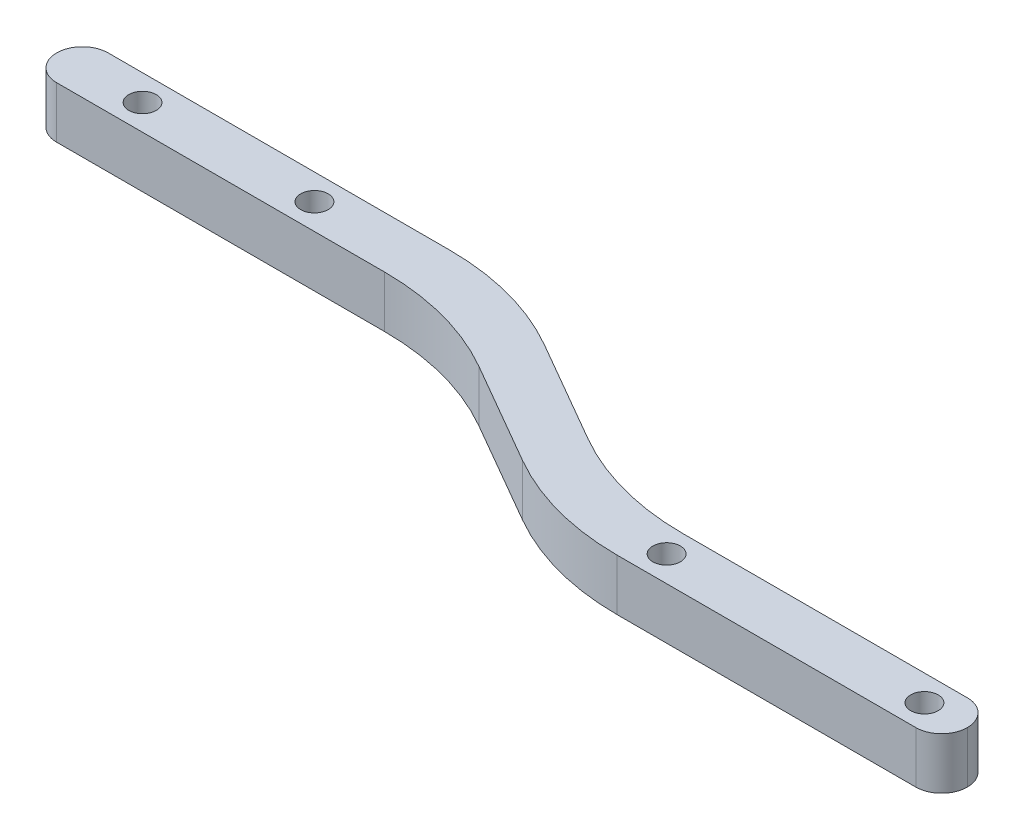
ISO-10303-21;
HEADER;
FILE_DESCRIPTION(('STEP AP214'),'2;1');
FILE_NAME('part.step','',(''),(''),'','','');
FILE_SCHEMA(('AUTOMOTIVE_DESIGN { 1 0 10303 214 1 1 1 1 }'));
ENDSEC;
DATA;
#1=APPLICATION_CONTEXT('core data for automotive mechanical design processes');
#2=APPLICATION_PROTOCOL_DEFINITION('international standard','automotive_design',2000,#1);
#3=PRODUCT_CONTEXT('',#1,'mechanical');
#4=PRODUCT('Part','Part','',(#3));
#5=PRODUCT_RELATED_PRODUCT_CATEGORY('part','',(#4));
#6=PRODUCT_DEFINITION_FORMATION('','',#4);
#7=PRODUCT_DEFINITION_CONTEXT('part definition',#1,'design');
#8=PRODUCT_DEFINITION('design','',#6,#7);
#9=PRODUCT_DEFINITION_SHAPE('','',#8);
#10=(LENGTH_UNIT() NAMED_UNIT(*) SI_UNIT(.MILLI.,.METRE.));
#11=(NAMED_UNIT(*) PLANE_ANGLE_UNIT() SI_UNIT($,.RADIAN.));
#12=(NAMED_UNIT(*) SI_UNIT($,.STERADIAN.) SOLID_ANGLE_UNIT());
#13=UNCERTAINTY_MEASURE_WITH_UNIT(LENGTH_MEASURE(1.E-05),#10,'distance_accuracy_value','');
#14=(GEOMETRIC_REPRESENTATION_CONTEXT(3) GLOBAL_UNCERTAINTY_ASSIGNED_CONTEXT((#13)) GLOBAL_UNIT_ASSIGNED_CONTEXT((#10,
#11,#12)) REPRESENTATION_CONTEXT('',''));
#15=CARTESIAN_POINT('',(0.,0.,0.));
#16=DIRECTION('',(0.,0.,1.));
#17=DIRECTION('',(1.,0.,0.));
#18=AXIS2_PLACEMENT_3D('',#15,#16,#17);
#19=CARTESIAN_POINT('',(-22.0980762113533,3.,0.));
#20=DIRECTION('',(-0.5,0.,0.866025403784439));
#21=DIRECTION('',(0.866025403784439,0.,0.5));
#22=AXIS2_PLACEMENT_3D('',#19,#20,#21);
#23=PLANE('',#22);
#24=DIRECTION('',(-0.866025403784439,0.,-0.5));
#25=VECTOR('',#24,1.);
#26=CARTESIAN_POINT('',(-22.0980762113533,-3.,0.));
#27=LINE('',#26,#25);
#28=CARTESIAN_POINT('',(-29.0596004384196,-3.,-4.01923788646684));
#29=VERTEX_POINT('',#28);
#30=CARTESIAN_POINT('',(-41.1173140978201,-3.,-10.9807621135331));
#31=VERTEX_POINT('',#30);
#32=EDGE_CURVE('E294',#29,#31,#27,.T.);
#33=ORIENTED_EDGE('',*,*,#32,.T.);
#34=DIRECTION('',(0.,-1.,0.));
#35=VECTOR('',#34,1.);
#36=CARTESIAN_POINT('',(-41.1173140978201,3.,-10.9807621135331));
#37=LINE('',#36,#35);
#38=CARTESIAN_POINT('',(-41.1173140978201,3.,-10.9807621135331));
#39=VERTEX_POINT('',#38);
#40=EDGE_CURVE('E211',#31,#39,#37,.F.);
#41=ORIENTED_EDGE('',*,*,#40,.T.);
#42=DIRECTION('',(-0.866025403784439,0.,-0.5));
#43=VECTOR('',#42,1.);
#44=CARTESIAN_POINT('',(-22.0980762113533,3.,0.));
#45=LINE('',#44,#43);
#46=CARTESIAN_POINT('',(-29.0596004384196,3.,-4.01923788646684));
#47=VERTEX_POINT('',#46);
#48=EDGE_CURVE('E180',#47,#39,#45,.T.);
#49=ORIENTED_EDGE('',*,*,#48,.F.);
#50=DIRECTION('',(0.,-1.,0.));
#51=VECTOR('',#50,1.);
#52=CARTESIAN_POINT('',(-29.0596004384196,-3.,-4.01923788646685));
#53=LINE('',#52,#51);
#54=EDGE_CURVE('E207',#47,#29,#53,.T.);
#55=ORIENTED_EDGE('',*,*,#54,.T.);
#56=EDGE_LOOP('',(#33,#41,#49,#55));
#57=FACE_BOUND('',#56,.T.);
#58=ADVANCED_FACE('F39',(#57),#23,.F.);
#59=CARTESIAN_POINT('',(-48.0788383248864,3.,-15.));
#60=DIRECTION('',(0.,0.,1.));
#61=DIRECTION('',(1.,0.,0.));
#62=AXIS2_PLACEMENT_3D('',#59,#60,#61);
#63=PLANE('',#62);
#64=DIRECTION('',(-1.,0.,0.));
#65=VECTOR('',#64,1.);
#66=CARTESIAN_POINT('',(-48.0788383248864,-3.,-15.));
#67=LINE('',#66,#65);
#68=CARTESIAN_POINT('',(-56.1173140978201,-3.,-15.));
#69=VERTEX_POINT('',#68);
#70=CARTESIAN_POINT('',(-95.8826859021798,-3.,-15.));
#71=VERTEX_POINT('',#70);
#72=EDGE_CURVE('E298',#69,#71,#67,.T.);
#73=ORIENTED_EDGE('',*,*,#72,.T.);
#74=DIRECTION('',(0.,-1.,0.));
#75=VECTOR('',#74,1.);
#76=CARTESIAN_POINT('',(-95.8826859021798,3.,-15.));
#77=LINE('',#76,#75);
#78=CARTESIAN_POINT('',(-95.8826859021798,3.,-15.));
#79=VERTEX_POINT('',#78);
#80=EDGE_CURVE('E65',#71,#79,#77,.F.);
#81=ORIENTED_EDGE('',*,*,#80,.T.);
#82=DIRECTION('',(-1.,0.,0.));
#83=VECTOR('',#82,1.);
#84=CARTESIAN_POINT('',(-48.0788383248864,3.,-15.));
#85=LINE('',#84,#83);
#86=CARTESIAN_POINT('',(-56.1173140978201,3.,-15.));
#87=VERTEX_POINT('',#86);
#88=EDGE_CURVE('E318',#87,#79,#85,.T.);
#89=ORIENTED_EDGE('',*,*,#88,.F.);
#90=DIRECTION('',(0.,-1.,0.));
#91=VECTOR('',#90,1.);
#92=CARTESIAN_POINT('',(-56.1173140978201,3.,-15.));
#93=LINE('',#92,#91);
#94=EDGE_CURVE('E203',#87,#69,#93,.T.);
#95=ORIENTED_EDGE('',*,*,#94,.T.);
#96=EDGE_LOOP('',(#73,#81,#89,#95));
#97=FACE_BOUND('',#96,.T.);
#98=ADVANCED_FACE('F385',(#97),#63,.F.);
#99=CARTESIAN_POINT('',(-98.8826859021798,3.,-8.99999999999997));
#100=DIRECTION('',(0.,0.,-1.));
#101=DIRECTION('',(-1.,0.,0.));
#102=AXIS2_PLACEMENT_3D('',#99,#100,#101);
#103=PLANE('',#102);
#104=DIRECTION('',(1.,0.,0.));
#105=VECTOR('',#104,1.);
#106=CARTESIAN_POINT('',(-98.8826859021798,3.,-8.99999999999997));
#107=LINE('',#106,#105);
#108=CARTESIAN_POINT('',(-95.8826859021798,3.,-8.99999999999997));
#109=VERTEX_POINT('',#108);
#110=CARTESIAN_POINT('',(-57.7250092524069,3.,-8.99999999999997));
#111=VERTEX_POINT('',#110);
#112=EDGE_CURVE('E313',#109,#111,#107,.T.);
#113=ORIENTED_EDGE('',*,*,#112,.F.);
#114=DIRECTION('',(0.,-1.,0.));
#115=VECTOR('',#114,1.);
#116=CARTESIAN_POINT('',(-95.8826859021798,3.,-8.99999999999997));
#117=LINE('',#116,#115);
#118=CARTESIAN_POINT('',(-95.8826859021798,-3.,-8.99999999999997));
#119=VERTEX_POINT('',#118);
#120=EDGE_CURVE('E232',#109,#119,#117,.T.);
#121=ORIENTED_EDGE('',*,*,#120,.T.);
#122=DIRECTION('',(1.,0.,0.));
#123=VECTOR('',#122,1.);
#124=CARTESIAN_POINT('',(-98.8826859021798,-3.,-8.99999999999997));
#125=LINE('',#124,#123);
#126=CARTESIAN_POINT('',(-57.7250092524069,-3.,-8.99999999999997));
#127=VERTEX_POINT('',#126);
#128=EDGE_CURVE('E182',#119,#127,#125,.T.);
#129=ORIENTED_EDGE('',*,*,#128,.T.);
#130=DIRECTION('',(0.,-1.,0.));
#131=VECTOR('',#130,1.);
#132=CARTESIAN_POINT('',(-57.7250092524069,3.,-8.99999999999997));
#133=LINE('',#132,#131);
#134=EDGE_CURVE('E199',#127,#111,#133,.F.);
#135=ORIENTED_EDGE('',*,*,#134,.T.);
#136=EDGE_LOOP('',(#113,#121,#129,#135));
#137=FACE_BOUND('',#136,.T.);
#138=ADVANCED_FACE('F304',(#137),#103,.F.);
#139=CARTESIAN_POINT('',(-49.6865334794732,3.,-8.99999999999997));
#140=DIRECTION('',(0.499999999999999,0.,-0.866025403784439));
#141=DIRECTION('',(-0.866025403784439,0.,-0.5));
#142=AXIS2_PLACEMENT_3D('',#139,#140,#141);
#143=PLANE('',#142);
#144=DIRECTION('',(0.866025403784439,0.,0.5));
#145=VECTOR('',#144,1.);
#146=CARTESIAN_POINT('',(-49.6865334794732,-3.,-8.99999999999997));
#147=LINE('',#146,#145);
#148=CARTESIAN_POINT('',(-42.7250092524069,-3.,-4.98076211353314));
#149=VERTEX_POINT('',#148);
#150=CARTESIAN_POINT('',(-30.6672955930064,-3.,1.98076211353317));
#151=VERTEX_POINT('',#150);
#152=EDGE_CURVE('E176',#149,#151,#147,.T.);
#153=ORIENTED_EDGE('',*,*,#152,.T.);
#154=DIRECTION('',(0.,-1.,0.));
#155=VECTOR('',#154,1.);
#156=CARTESIAN_POINT('',(-30.6672955930064,3.,1.98076211353317));
#157=LINE('',#156,#155);
#158=CARTESIAN_POINT('',(-30.6672955930064,3.,1.98076211353317));
#159=VERTEX_POINT('',#158);
#160=EDGE_CURVE('E149',#151,#159,#157,.F.);
#161=ORIENTED_EDGE('',*,*,#160,.T.);
#162=DIRECTION('',(0.866025403784439,0.,0.5));
#163=VECTOR('',#162,1.);
#164=CARTESIAN_POINT('',(-49.6865334794732,3.,-8.99999999999997));
#165=LINE('',#164,#163);
#166=CARTESIAN_POINT('',(-42.7250092524069,3.,-4.98076211353314));
#167=VERTEX_POINT('',#166);
#168=EDGE_CURVE('E290',#167,#159,#165,.T.);
#169=ORIENTED_EDGE('',*,*,#168,.F.);
#170=DIRECTION('',(0.,-1.,0.));
#171=VECTOR('',#170,1.);
#172=CARTESIAN_POINT('',(-42.7250092524069,-3.,-4.98076211353313));
#173=LINE('',#172,#171);
#174=EDGE_CURVE('E155',#167,#149,#173,.T.);
#175=ORIENTED_EDGE('',*,*,#174,.T.);
#176=EDGE_LOOP('',(#153,#161,#169,#175));
#177=FACE_BOUND('',#176,.T.);
#178=ADVANCED_FACE('F315',(#177),#143,.F.);
#179=CARTESIAN_POINT('',(-23.7057713659401,3.,6.));
#180=DIRECTION('',(0.,0.,-1.));
#181=DIRECTION('',(-1.,0.,0.));
#182=AXIS2_PLACEMENT_3D('',#179,#180,#181);
#183=PLANE('',#182);
#184=DIRECTION('',(1.,0.,0.));
#185=VECTOR('',#184,1.);
#186=CARTESIAN_POINT('',(-23.7057713659401,-3.,6.));
#187=LINE('',#186,#185);
#188=CARTESIAN_POINT('',(-15.6672955930064,-3.,6.));
#189=VERTEX_POINT('',#188);
#190=CARTESIAN_POINT('',(19.0980762113533,-3.,6.));
#191=VERTEX_POINT('',#190);
#192=EDGE_CURVE('E163',#189,#191,#187,.T.);
#193=ORIENTED_EDGE('',*,*,#192,.T.);
#194=DIRECTION('',(0.,-1.,0.));
#195=VECTOR('',#194,1.);
#196=CARTESIAN_POINT('',(19.0980762113533,3.,6.));
#197=LINE('',#196,#195);
#198=CARTESIAN_POINT('',(19.0980762113533,3.,6.));
#199=VERTEX_POINT('',#198);
#200=EDGE_CURVE('E49',#191,#199,#197,.F.);
#201=ORIENTED_EDGE('',*,*,#200,.T.);
#202=DIRECTION('',(1.,0.,0.));
#203=VECTOR('',#202,1.);
#204=CARTESIAN_POINT('',(-23.7057713659401,3.,6.));
#205=LINE('',#204,#203);
#206=CARTESIAN_POINT('',(-15.6672955930064,3.,6.));
#207=VERTEX_POINT('',#206);
#208=EDGE_CURVE('E166',#207,#199,#205,.T.);
#209=ORIENTED_EDGE('',*,*,#208,.F.);
#210=DIRECTION('',(0.,-1.,0.));
#211=VECTOR('',#210,1.);
#212=CARTESIAN_POINT('',(-15.6672955930064,3.,6.));
#213=LINE('',#212,#211);
#214=EDGE_CURVE('E148',#207,#189,#213,.T.);
#215=ORIENTED_EDGE('',*,*,#214,.T.);
#216=EDGE_LOOP('',(#193,#201,#209,#215));
#217=FACE_BOUND('',#216,.T.);
#218=ADVANCED_FACE('F161',(#217),#183,.F.);
#219=CARTESIAN_POINT('',(22.0980762113533,3.,0.));
#220=DIRECTION('',(0.,0.,1.));
#221=DIRECTION('',(1.,0.,0.));
#222=AXIS2_PLACEMENT_3D('',#219,#220,#221);
#223=PLANE('',#222);
#224=DIRECTION('',(-1.,0.,0.));
#225=VECTOR('',#224,1.);
#226=CARTESIAN_POINT('',(22.0980762113533,3.,0.));
#227=LINE('',#226,#225);
#228=CARTESIAN_POINT('',(19.0980762113533,3.,0.));
#229=VERTEX_POINT('',#228);
#230=CARTESIAN_POINT('',(-14.0596004384196,3.,0.));
#231=VERTEX_POINT('',#230);
#232=EDGE_CURVE('E168',#229,#231,#227,.T.);
#233=ORIENTED_EDGE('',*,*,#232,.F.);
#234=DIRECTION('',(0.,-1.,0.));
#235=VECTOR('',#234,1.);
#236=CARTESIAN_POINT('',(19.0980762113533,3.,0.));
#237=LINE('',#236,#235);
#238=CARTESIAN_POINT('',(19.0980762113533,-3.,0.));
#239=VERTEX_POINT('',#238);
#240=EDGE_CURVE('E11',#229,#239,#237,.T.);
#241=ORIENTED_EDGE('',*,*,#240,.T.);
#242=DIRECTION('',(-1.,0.,0.));
#243=VECTOR('',#242,1.);
#244=CARTESIAN_POINT('',(22.0980762113533,-3.,0.));
#245=LINE('',#244,#243);
#246=CARTESIAN_POINT('',(-14.0596004384196,-3.,0.));
#247=VERTEX_POINT('',#246);
#248=EDGE_CURVE('E175',#239,#247,#245,.T.);
#249=ORIENTED_EDGE('',*,*,#248,.T.);
#250=DIRECTION('',(0.,-1.,0.));
#251=VECTOR('',#250,1.);
#252=CARTESIAN_POINT('',(-14.0596004384196,3.,0.));
#253=LINE('',#252,#251);
#254=EDGE_CURVE('E214',#247,#231,#253,.F.);
#255=ORIENTED_EDGE('',*,*,#254,.T.);
#256=EDGE_LOOP('',(#233,#241,#249,#255));
#257=FACE_BOUND('',#256,.T.);
#258=ADVANCED_FACE('F283',(#257),#223,.F.);
#259=CARTESIAN_POINT('',(0.,3.,0.));
#260=DIRECTION('',(0.,1.,0.));
#261=DIRECTION('',(0.,0.,1.));
#262=AXIS2_PLACEMENT_3D('',#259,#260,#261);
#263=PLANE('',#262);
#264=CARTESIAN_POINT('',(17.0980762113533,3.,3.));
#265=DIRECTION('',(0.,1.,0.));
#266=DIRECTION('',(0.,0.,1.));
#267=AXIS2_PLACEMENT_3D('',#264,#265,#266);
#268=CIRCLE('',#267,1.60000000000001);
#269=CARTESIAN_POINT('',(17.0980762113533,3.,4.6));
#270=VERTEX_POINT('',#269);
#271=EDGE_CURVE('E345',#270,#270,#268,.T.);
#272=ORIENTED_EDGE('',*,*,#271,.F.);
#273=EDGE_LOOP('',(#272));
#274=FACE_BOUND('',#273,.T.);
#275=CARTESIAN_POINT('',(-12.9019237886467,3.,3.));
#276=DIRECTION('',(0.,1.,0.));
#277=DIRECTION('',(0.,0.,1.));
#278=AXIS2_PLACEMENT_3D('',#275,#276,#277);
#279=CIRCLE('',#278,1.6);
#280=CARTESIAN_POINT('',(-12.9019237886467,3.,4.6));
#281=VERTEX_POINT('',#280);
#282=EDGE_CURVE('E337',#281,#281,#279,.T.);
#283=ORIENTED_EDGE('',*,*,#282,.F.);
#284=EDGE_LOOP('',(#283));
#285=FACE_BOUND('',#284,.T.);
#286=CARTESIAN_POINT('',(-68.8826859021798,3.,-12.));
#287=DIRECTION('',(0.,1.,0.));
#288=DIRECTION('',(0.,0.,1.));
#289=AXIS2_PLACEMENT_3D('',#286,#287,#288);
#290=CIRCLE('',#289,1.6);
#291=CARTESIAN_POINT('',(-68.8826859021798,3.,-10.4));
#292=VERTEX_POINT('',#291);
#293=EDGE_CURVE('E329',#292,#292,#290,.T.);
#294=ORIENTED_EDGE('',*,*,#293,.F.);
#295=EDGE_LOOP('',(#294));
#296=FACE_BOUND('',#295,.T.);
#297=CARTESIAN_POINT('',(-88.8826859021798,3.,-12.));
#298=DIRECTION('',(0.,1.,0.));
#299=DIRECTION('',(0.,0.,1.));
#300=AXIS2_PLACEMENT_3D('',#297,#298,#299);
#301=CIRCLE('',#300,1.6);
#302=CARTESIAN_POINT('',(-88.8826859021798,3.,-10.4));
#303=VERTEX_POINT('',#302);
#304=EDGE_CURVE('E264',#303,#303,#301,.T.);
#305=ORIENTED_EDGE('',*,*,#304,.F.);
#306=EDGE_LOOP('',(#305));
#307=FACE_BOUND('',#306,.T.);
#308=CARTESIAN_POINT('',(-95.8826859021798,3.,-12.));
#309=DIRECTION('',(0.,1.,0.));
#310=DIRECTION('',(0.,0.,1.));
#311=AXIS2_PLACEMENT_3D('',#308,#309,#310);
#312=CIRCLE('',#311,3.);
#313=CARTESIAN_POINT('',(-98.8826859021798,3.,-12.));
#314=VERTEX_POINT('',#313);
#315=EDGE_CURVE('E57',#79,#314,#312,.T.);
#316=ORIENTED_EDGE('',*,*,#315,.T.);
#317=CARTESIAN_POINT('',(-95.8826859021798,3.,-12.));
#318=DIRECTION('',(0.,1.,0.));
#319=DIRECTION('',(0.,0.,1.));
#320=AXIS2_PLACEMENT_3D('',#317,#318,#319);
#321=CIRCLE('',#320,3.);
#322=EDGE_CURVE('E255',#314,#109,#321,.T.);
#323=ORIENTED_EDGE('',*,*,#322,.T.);
#324=ORIENTED_EDGE('',*,*,#112,.T.);
#325=CARTESIAN_POINT('',(-57.7250092524069,3.,21.));
#326=DIRECTION('',(0.,1.,0.));
#327=DIRECTION('',(0.,0.,1.));
#328=AXIS2_PLACEMENT_3D('',#325,#326,#327);
#329=CIRCLE('',#328,30.);
#330=EDGE_CURVE('E222',#111,#167,#329,.F.);
#331=ORIENTED_EDGE('',*,*,#330,.T.);
#332=ORIENTED_EDGE('',*,*,#168,.T.);
#333=CARTESIAN_POINT('',(-15.6672955930064,3.,-24.));
#334=DIRECTION('',(0.,1.,0.));
#335=DIRECTION('',(0.,0.,1.));
#336=AXIS2_PLACEMENT_3D('',#333,#334,#335);
#337=CIRCLE('',#336,30.);
#338=EDGE_CURVE('E196',#159,#207,#337,.T.);
#339=ORIENTED_EDGE('',*,*,#338,.T.);
#340=ORIENTED_EDGE('',*,*,#208,.T.);
#341=CARTESIAN_POINT('',(19.0980762113533,3.,3.));
#342=DIRECTION('',(0.,1.,0.));
#343=DIRECTION('',(0.,0.,1.));
#344=AXIS2_PLACEMENT_3D('',#341,#342,#343);
#345=CIRCLE('',#344,3.);
#346=CARTESIAN_POINT('',(22.0980762113533,3.,3.));
#347=VERTEX_POINT('',#346);
#348=EDGE_CURVE('E250',#199,#347,#345,.T.);
#349=ORIENTED_EDGE('',*,*,#348,.T.);
#350=CARTESIAN_POINT('',(19.0980762113533,3.,3.));
#351=DIRECTION('',(0.,1.,0.));
#352=DIRECTION('',(0.,0.,1.));
#353=AXIS2_PLACEMENT_3D('',#350,#351,#352);
#354=CIRCLE('',#353,3.);
#355=EDGE_CURVE('E247',#347,#229,#354,.T.);
#356=ORIENTED_EDGE('',*,*,#355,.T.);
#357=ORIENTED_EDGE('',*,*,#232,.T.);
#358=CARTESIAN_POINT('',(-14.0596004384196,3.,-30.));
#359=DIRECTION('',(0.,1.,0.));
#360=DIRECTION('',(0.,0.,1.));
#361=AXIS2_PLACEMENT_3D('',#358,#359,#360);
#362=CIRCLE('',#361,30.);
#363=EDGE_CURVE('E229',#231,#47,#362,.F.);
#364=ORIENTED_EDGE('',*,*,#363,.T.);
#365=ORIENTED_EDGE('',*,*,#48,.T.);
#366=CARTESIAN_POINT('',(-56.1173140978201,3.,15.));
#367=DIRECTION('',(0.,1.,0.));
#368=DIRECTION('',(0.,0.,1.));
#369=AXIS2_PLACEMENT_3D('',#366,#367,#368);
#370=CIRCLE('',#369,30.);
#371=EDGE_CURVE('E193',#39,#87,#370,.T.);
#372=ORIENTED_EDGE('',*,*,#371,.T.);
#373=ORIENTED_EDGE('',*,*,#88,.T.);
#374=EDGE_LOOP('',(#316,#323,#324,#331,#332,#339,#340,#349,#356,#357,#364,#365,#372,#373));
#375=FACE_BOUND('',#374,.T.);
#376=ADVANCED_FACE('F281',(#274,#285,#296,#307,#375),#263,.T.);
#377=CARTESIAN_POINT('',(0.,-3.,0.));
#378=DIRECTION('',(0.,1.,0.));
#379=DIRECTION('',(0.,0.,1.));
#380=AXIS2_PLACEMENT_3D('',#377,#378,#379);
#381=PLANE('',#380);
#382=CARTESIAN_POINT('',(17.0980762113533,-3.,3.));
#383=DIRECTION('',(0.,1.,0.));
#384=DIRECTION('',(0.,0.,1.));
#385=AXIS2_PLACEMENT_3D('',#382,#383,#384);
#386=CIRCLE('',#385,1.60000000000001);
#387=CARTESIAN_POINT('',(17.0980762113533,-3.,4.6));
#388=VERTEX_POINT('',#387);
#389=EDGE_CURVE('E299',#388,#388,#386,.T.);
#390=ORIENTED_EDGE('',*,*,#389,.T.);
#391=EDGE_LOOP('',(#390));
#392=FACE_BOUND('',#391,.T.);
#393=CARTESIAN_POINT('',(-12.9019237886467,-3.,3.));
#394=DIRECTION('',(0.,1.,0.));
#395=DIRECTION('',(0.,0.,1.));
#396=AXIS2_PLACEMENT_3D('',#393,#394,#395);
#397=CIRCLE('',#396,1.6);
#398=CARTESIAN_POINT('',(-12.9019237886467,-3.,4.6));
#399=VERTEX_POINT('',#398);
#400=EDGE_CURVE('E341',#399,#399,#397,.T.);
#401=ORIENTED_EDGE('',*,*,#400,.T.);
#402=EDGE_LOOP('',(#401));
#403=FACE_BOUND('',#402,.T.);
#404=CARTESIAN_POINT('',(-68.8826859021798,-3.,-12.));
#405=DIRECTION('',(0.,1.,0.));
#406=DIRECTION('',(0.,0.,1.));
#407=AXIS2_PLACEMENT_3D('',#404,#405,#406);
#408=CIRCLE('',#407,1.6);
#409=CARTESIAN_POINT('',(-68.8826859021798,-3.,-10.4));
#410=VERTEX_POINT('',#409);
#411=EDGE_CURVE('E333',#410,#410,#408,.T.);
#412=ORIENTED_EDGE('',*,*,#411,.T.);
#413=EDGE_LOOP('',(#412));
#414=FACE_BOUND('',#413,.T.);
#415=CARTESIAN_POINT('',(-88.8826859021798,-3.,-12.));
#416=DIRECTION('',(0.,1.,0.));
#417=DIRECTION('',(0.,0.,1.));
#418=AXIS2_PLACEMENT_3D('',#415,#416,#417);
#419=CIRCLE('',#418,1.6);
#420=CARTESIAN_POINT('',(-88.8826859021798,-3.,-10.4));
#421=VERTEX_POINT('',#420);
#422=EDGE_CURVE('E270',#421,#421,#419,.T.);
#423=ORIENTED_EDGE('',*,*,#422,.T.);
#424=EDGE_LOOP('',(#423));
#425=FACE_BOUND('',#424,.T.);
#426=ORIENTED_EDGE('',*,*,#128,.F.);
#427=CARTESIAN_POINT('',(-95.8826859021798,-3.,-12.));
#428=DIRECTION('',(0.,1.,0.));
#429=DIRECTION('',(0.,0.,1.));
#430=AXIS2_PLACEMENT_3D('',#427,#428,#429);
#431=CIRCLE('',#430,3.);
#432=CARTESIAN_POINT('',(-98.8826859021798,-3.,-12.));
#433=VERTEX_POINT('',#432);
#434=EDGE_CURVE('E244',#119,#433,#431,.F.);
#435=ORIENTED_EDGE('',*,*,#434,.T.);
#436=CARTESIAN_POINT('',(-95.8826859021798,-3.,-12.));
#437=DIRECTION('',(0.,1.,0.));
#438=DIRECTION('',(0.,0.,1.));
#439=AXIS2_PLACEMENT_3D('',#436,#437,#438);
#440=CIRCLE('',#439,3.);
#441=EDGE_CURVE('E241',#433,#71,#440,.F.);
#442=ORIENTED_EDGE('',*,*,#441,.T.);
#443=ORIENTED_EDGE('',*,*,#72,.F.);
#444=CARTESIAN_POINT('',(-56.1173140978201,-3.,15.));
#445=DIRECTION('',(0.,1.,0.));
#446=DIRECTION('',(0.,0.,1.));
#447=AXIS2_PLACEMENT_3D('',#444,#445,#446);
#448=CIRCLE('',#447,30.);
#449=EDGE_CURVE('E156',#69,#31,#448,.F.);
#450=ORIENTED_EDGE('',*,*,#449,.T.);
#451=ORIENTED_EDGE('',*,*,#32,.F.);
#452=CARTESIAN_POINT('',(-14.0596004384196,-3.,-30.));
#453=DIRECTION('',(0.,1.,0.));
#454=DIRECTION('',(0.,0.,1.));
#455=AXIS2_PLACEMENT_3D('',#452,#453,#454);
#456=CIRCLE('',#455,30.);
#457=EDGE_CURVE('E225',#29,#247,#456,.T.);
#458=ORIENTED_EDGE('',*,*,#457,.T.);
#459=ORIENTED_EDGE('',*,*,#248,.F.);
#460=CARTESIAN_POINT('',(19.0980762113533,-3.,3.));
#461=DIRECTION('',(0.,1.,0.));
#462=DIRECTION('',(0.,0.,1.));
#463=AXIS2_PLACEMENT_3D('',#460,#461,#462);
#464=CIRCLE('',#463,3.);
#465=CARTESIAN_POINT('',(22.0980762113533,-3.,3.));
#466=VERTEX_POINT('',#465);
#467=EDGE_CURVE('E236',#239,#466,#464,.F.);
#468=ORIENTED_EDGE('',*,*,#467,.T.);
#469=CARTESIAN_POINT('',(19.0980762113533,-3.,3.));
#470=DIRECTION('',(0.,1.,0.));
#471=DIRECTION('',(0.,0.,1.));
#472=AXIS2_PLACEMENT_3D('',#469,#470,#471);
#473=CIRCLE('',#472,3.);
#474=EDGE_CURVE('E173',#466,#191,#473,.F.);
#475=ORIENTED_EDGE('',*,*,#474,.T.);
#476=ORIENTED_EDGE('',*,*,#192,.F.);
#477=CARTESIAN_POINT('',(-15.6672955930064,-3.,-24.));
#478=DIRECTION('',(0.,1.,0.));
#479=DIRECTION('',(0.,0.,1.));
#480=AXIS2_PLACEMENT_3D('',#477,#478,#479);
#481=CIRCLE('',#480,30.);
#482=EDGE_CURVE('E144',#189,#151,#481,.F.);
#483=ORIENTED_EDGE('',*,*,#482,.T.);
#484=ORIENTED_EDGE('',*,*,#152,.F.);
#485=CARTESIAN_POINT('',(-57.7250092524069,-3.,21.));
#486=DIRECTION('',(0.,1.,0.));
#487=DIRECTION('',(0.,0.,1.));
#488=AXIS2_PLACEMENT_3D('',#485,#486,#487);
#489=CIRCLE('',#488,30.);
#490=EDGE_CURVE('E218',#149,#127,#489,.T.);
#491=ORIENTED_EDGE('',*,*,#490,.T.);
#492=EDGE_LOOP('',(#426,#435,#442,#443,#450,#451,#458,#459,#468,#475,#476,#483,#484,#491));
#493=FACE_BOUND('',#492,.T.);
#494=ADVANCED_FACE('F171',(#392,#403,#414,#425,#493),#381,.F.);
#495=CARTESIAN_POINT('',(-88.8826859021798,-3.,-12.));
#496=DIRECTION('',(0.,1.,0.));
#497=DIRECTION('',(0.,0.,1.));
#498=AXIS2_PLACEMENT_3D('',#495,#496,#497);
#499=CYLINDRICAL_SURFACE('',#498,1.6);
#500=ORIENTED_EDGE('',*,*,#422,.F.);
#501=EDGE_LOOP('',(#500));
#502=FACE_BOUND('',#501,.T.);
#503=ORIENTED_EDGE('',*,*,#304,.T.);
#504=EDGE_LOOP('',(#503));
#505=FACE_BOUND('',#504,.T.);
#506=ADVANCED_FACE('F371',(#502,#505),#499,.F.);
#507=CARTESIAN_POINT('',(-68.8826859021798,-3.,-12.));
#508=DIRECTION('',(0.,1.,0.));
#509=DIRECTION('',(0.,0.,1.));
#510=AXIS2_PLACEMENT_3D('',#507,#508,#509);
#511=CYLINDRICAL_SURFACE('',#510,1.6);
#512=ORIENTED_EDGE('',*,*,#411,.F.);
#513=EDGE_LOOP('',(#512));
#514=FACE_BOUND('',#513,.T.);
#515=ORIENTED_EDGE('',*,*,#293,.T.);
#516=EDGE_LOOP('',(#515));
#517=FACE_BOUND('',#516,.T.);
#518=ADVANCED_FACE('F373',(#514,#517),#511,.F.);
#519=CARTESIAN_POINT('',(-12.9019237886467,-3.,3.));
#520=DIRECTION('',(0.,1.,0.));
#521=DIRECTION('',(0.,0.,1.));
#522=AXIS2_PLACEMENT_3D('',#519,#520,#521);
#523=CYLINDRICAL_SURFACE('',#522,1.6);
#524=ORIENTED_EDGE('',*,*,#400,.F.);
#525=EDGE_LOOP('',(#524));
#526=FACE_BOUND('',#525,.T.);
#527=ORIENTED_EDGE('',*,*,#282,.T.);
#528=EDGE_LOOP('',(#527));
#529=FACE_BOUND('',#528,.T.);
#530=ADVANCED_FACE('F358',(#526,#529),#523,.F.);
#531=CARTESIAN_POINT('',(17.0980762113533,-3.,3.));
#532=DIRECTION('',(0.,1.,0.));
#533=DIRECTION('',(0.,0.,1.));
#534=AXIS2_PLACEMENT_3D('',#531,#532,#533);
#535=CYLINDRICAL_SURFACE('',#534,1.60000000000001);
#536=ORIENTED_EDGE('',*,*,#389,.F.);
#537=EDGE_LOOP('',(#536));
#538=FACE_BOUND('',#537,.T.);
#539=ORIENTED_EDGE('',*,*,#271,.T.);
#540=EDGE_LOOP('',(#539));
#541=FACE_BOUND('',#540,.T.);
#542=ADVANCED_FACE('F355',(#538,#541),#535,.F.);
#543=CARTESIAN_POINT('',(-15.6672955930064,3.,-24.));
#544=DIRECTION('',(0.,-1.,0.));
#545=DIRECTION('',(0.,0.,-1.));
#546=AXIS2_PLACEMENT_3D('',#543,#544,#545);
#547=CYLINDRICAL_SURFACE('',#546,30.);
#548=ORIENTED_EDGE('',*,*,#338,.F.);
#549=ORIENTED_EDGE('',*,*,#160,.F.);
#550=ORIENTED_EDGE('',*,*,#482,.F.);
#551=ORIENTED_EDGE('',*,*,#214,.F.);
#552=EDGE_LOOP('',(#548,#549,#550,#551));
#553=FACE_BOUND('',#552,.T.);
#554=ADVANCED_FACE('F147',(#553),#547,.T.);
#555=CARTESIAN_POINT('',(-57.7250092524069,3.,21.));
#556=DIRECTION('',(0.,1.,0.));
#557=DIRECTION('',(0.,0.,1.));
#558=AXIS2_PLACEMENT_3D('',#555,#556,#557);
#559=CYLINDRICAL_SURFACE('',#558,30.);
#560=ORIENTED_EDGE('',*,*,#330,.F.);
#561=ORIENTED_EDGE('',*,*,#134,.F.);
#562=ORIENTED_EDGE('',*,*,#490,.F.);
#563=ORIENTED_EDGE('',*,*,#174,.F.);
#564=EDGE_LOOP('',(#560,#561,#562,#563));
#565=FACE_BOUND('',#564,.T.);
#566=ADVANCED_FACE('F310',(#565),#559,.F.);
#567=CARTESIAN_POINT('',(-56.1173140978201,3.,15.));
#568=DIRECTION('',(0.,-1.,0.));
#569=DIRECTION('',(0.,0.,-1.));
#570=AXIS2_PLACEMENT_3D('',#567,#568,#569);
#571=CYLINDRICAL_SURFACE('',#570,30.);
#572=ORIENTED_EDGE('',*,*,#371,.F.);
#573=ORIENTED_EDGE('',*,*,#40,.F.);
#574=ORIENTED_EDGE('',*,*,#449,.F.);
#575=ORIENTED_EDGE('',*,*,#94,.F.);
#576=EDGE_LOOP('',(#572,#573,#574,#575));
#577=FACE_BOUND('',#576,.T.);
#578=ADVANCED_FACE('F398',(#577),#571,.T.);
#579=CARTESIAN_POINT('',(-14.0596004384196,3.,-30.));
#580=DIRECTION('',(0.,1.,0.));
#581=DIRECTION('',(0.,0.,1.));
#582=AXIS2_PLACEMENT_3D('',#579,#580,#581);
#583=CYLINDRICAL_SURFACE('',#582,30.);
#584=ORIENTED_EDGE('',*,*,#363,.F.);
#585=ORIENTED_EDGE('',*,*,#254,.F.);
#586=ORIENTED_EDGE('',*,*,#457,.F.);
#587=ORIENTED_EDGE('',*,*,#54,.F.);
#588=EDGE_LOOP('',(#584,#585,#586,#587));
#589=FACE_BOUND('',#588,.T.);
#590=ADVANCED_FACE('F401',(#589),#583,.F.);
#591=CARTESIAN_POINT('',(-95.8826859021798,3.,-12.));
#592=DIRECTION('',(0.,-1.,0.));
#593=DIRECTION('',(0.,0.,-1.));
#594=AXIS2_PLACEMENT_3D('',#591,#592,#593);
#595=CYLINDRICAL_SURFACE('',#594,3.);
#596=DIRECTION('',(0.,-1.,0.));
#597=VECTOR('',#596,1.);
#598=CARTESIAN_POINT('',(-98.8826859021798,3.,-12.));
#599=LINE('',#598,#597);
#600=EDGE_CURVE('E261',#314,#433,#599,.T.);
#601=ORIENTED_EDGE('',*,*,#600,.F.);
#602=ORIENTED_EDGE('',*,*,#315,.F.);
#603=ORIENTED_EDGE('',*,*,#80,.F.);
#604=ORIENTED_EDGE('',*,*,#441,.F.);
#605=EDGE_LOOP('',(#601,#602,#603,#604));
#606=FACE_BOUND('',#605,.T.);
#607=ADVANCED_FACE('F405',(#606),#595,.T.);
#608=CARTESIAN_POINT('',(-95.8826859021798,3.,-12.));
#609=DIRECTION('',(0.,-1.,0.));
#610=DIRECTION('',(0.,0.,-1.));
#611=AXIS2_PLACEMENT_3D('',#608,#609,#610);
#612=CYLINDRICAL_SURFACE('',#611,3.);
#613=ORIENTED_EDGE('',*,*,#322,.F.);
#614=ORIENTED_EDGE('',*,*,#600,.T.);
#615=ORIENTED_EDGE('',*,*,#434,.F.);
#616=ORIENTED_EDGE('',*,*,#120,.F.);
#617=EDGE_LOOP('',(#613,#614,#615,#616));
#618=FACE_BOUND('',#617,.T.);
#619=ADVANCED_FACE('F407',(#618),#612,.T.);
#620=CARTESIAN_POINT('',(19.0980762113533,3.,3.));
#621=DIRECTION('',(0.,-1.,0.));
#622=DIRECTION('',(0.,0.,-1.));
#623=AXIS2_PLACEMENT_3D('',#620,#621,#622);
#624=CYLINDRICAL_SURFACE('',#623,3.);
#625=ORIENTED_EDGE('',*,*,#240,.F.);
#626=ORIENTED_EDGE('',*,*,#355,.F.);
#627=DIRECTION('',(0.,-1.,0.));
#628=VECTOR('',#627,1.);
#629=CARTESIAN_POINT('',(22.0980762113533,3.,3.));
#630=LINE('',#629,#628);
#631=EDGE_CURVE('E43',#466,#347,#630,.F.);
#632=ORIENTED_EDGE('',*,*,#631,.F.);
#633=ORIENTED_EDGE('',*,*,#467,.F.);
#634=EDGE_LOOP('',(#625,#626,#632,#633));
#635=FACE_BOUND('',#634,.T.);
#636=ADVANCED_FACE('F41',(#635),#624,.T.);
#637=CARTESIAN_POINT('',(19.0980762113533,3.,3.));
#638=DIRECTION('',(0.,-1.,0.));
#639=DIRECTION('',(0.,0.,-1.));
#640=AXIS2_PLACEMENT_3D('',#637,#638,#639);
#641=CYLINDRICAL_SURFACE('',#640,3.);
#642=ORIENTED_EDGE('',*,*,#348,.F.);
#643=ORIENTED_EDGE('',*,*,#200,.F.);
#644=ORIENTED_EDGE('',*,*,#474,.F.);
#645=ORIENTED_EDGE('',*,*,#631,.T.);
#646=EDGE_LOOP('',(#642,#643,#644,#645));
#647=FACE_BOUND('',#646,.T.);
#648=ADVANCED_FACE('F275',(#647),#641,.T.);
#649=CLOSED_SHELL('',(#58,#98,#138,#178,#218,#258,#376,#494,#506,#518,#530,#542,#554,#566,#578,
#590,#607,#619,#636,#648));
#650=MANIFOLD_SOLID_BREP('B2',#649);
#651=ADVANCED_BREP_SHAPE_REPRESENTATION('',(#18,#650),#14);
#652=SHAPE_DEFINITION_REPRESENTATION(#9,#651);
ENDSEC;
END-ISO-10303-21;
